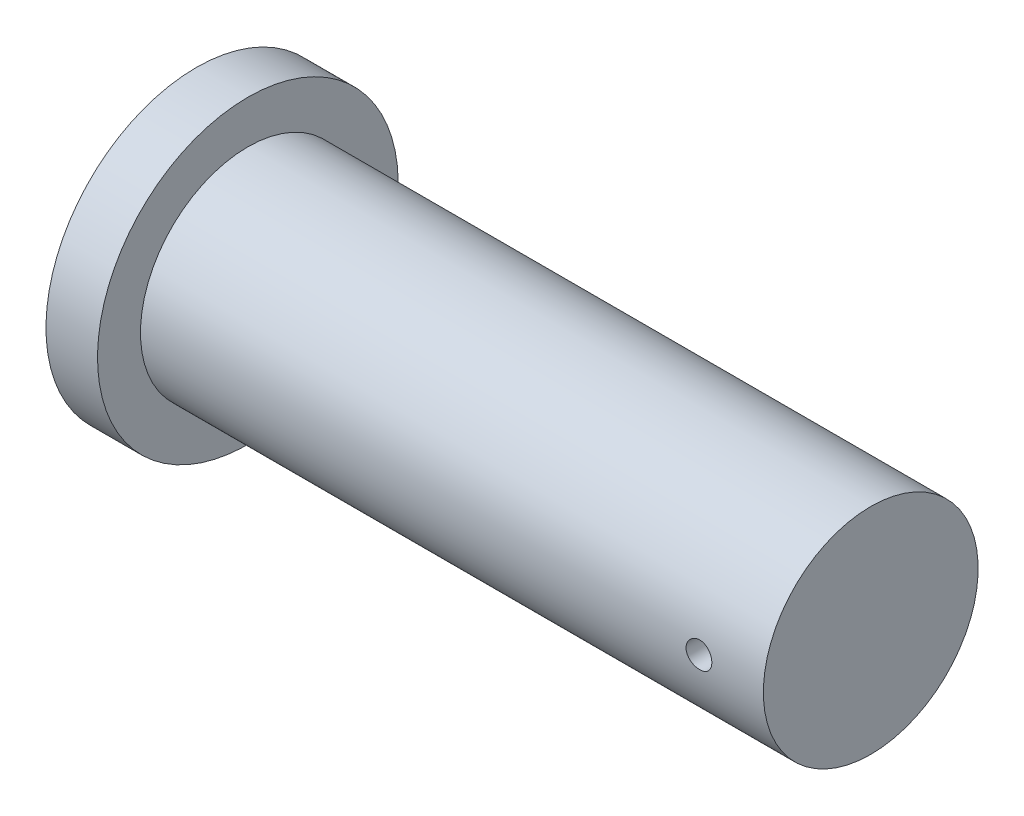
ISO-10303-21;
HEADER;
FILE_DESCRIPTION(('STEP AP214'),'2;1');
FILE_NAME('part.step','',(''),(''),'','','');
FILE_SCHEMA(('AUTOMOTIVE_DESIGN { 1 0 10303 214 1 1 1 1 }'));
ENDSEC;
DATA;
#1=APPLICATION_CONTEXT('core data for automotive mechanical design processes');
#2=APPLICATION_PROTOCOL_DEFINITION('international standard','automotive_design',2000,#1);
#3=PRODUCT_CONTEXT('',#1,'mechanical');
#4=PRODUCT('Part','Part','',(#3));
#5=PRODUCT_RELATED_PRODUCT_CATEGORY('part','',(#4));
#6=PRODUCT_DEFINITION_FORMATION('','',#4);
#7=PRODUCT_DEFINITION_CONTEXT('part definition',#1,'design');
#8=PRODUCT_DEFINITION('design','',#6,#7);
#9=PRODUCT_DEFINITION_SHAPE('','',#8);
#10=(LENGTH_UNIT() NAMED_UNIT(*) SI_UNIT(.MILLI.,.METRE.));
#11=(NAMED_UNIT(*) PLANE_ANGLE_UNIT() SI_UNIT($,.RADIAN.));
#12=(NAMED_UNIT(*) SI_UNIT($,.STERADIAN.) SOLID_ANGLE_UNIT());
#13=UNCERTAINTY_MEASURE_WITH_UNIT(LENGTH_MEASURE(1.E-05),#10,'distance_accuracy_value','');
#14=(GEOMETRIC_REPRESENTATION_CONTEXT(3) GLOBAL_UNCERTAINTY_ASSIGNED_CONTEXT((#13)) GLOBAL_UNIT_ASSIGNED_CONTEXT((#10,
#11,#12)) REPRESENTATION_CONTEXT('',''));
#15=CARTESIAN_POINT('',(0.,0.,0.));
#16=DIRECTION('',(0.,0.,1.));
#17=DIRECTION('',(1.,0.,0.));
#18=AXIS2_PLACEMENT_3D('',#15,#16,#17);
#19=CARTESIAN_POINT('',(0.,250.,0.));
#20=DIRECTION('',(1.,0.,0.));
#21=DIRECTION('',(0.,1.,0.));
#22=AXIS2_PLACEMENT_3D('',#19,#20,#21);
#23=PLANE('',#22);
#24=CARTESIAN_POINT('',(0.,0.,0.));
#25=DIRECTION('',(1.,0.,0.));
#26=DIRECTION('',(0.,1.,0.));
#27=AXIS2_PLACEMENT_3D('',#24,#25,#26);
#28=CIRCLE('',#27,250.);
#29=CARTESIAN_POINT('',(0.,250.,0.));
#30=VERTEX_POINT('',#29);
#31=EDGE_CURVE('E87',#30,#30,#28,.T.);
#32=ORIENTED_EDGE('',*,*,#31,.T.);
#33=EDGE_LOOP('',(#32));
#34=FACE_BOUND('',#33,.T.);
#35=ADVANCED_FACE('F37',(#34),#23,.T.);
#36=CARTESIAN_POINT('',(-1570.,-1.92269547466134E-13,0.));
#37=DIRECTION('',(-1.,0.,0.));
#38=DIRECTION('',(0.,-1.,0.));
#39=AXIS2_PLACEMENT_3D('',#36,#37,#38);
#40=PLANE('',#39);
#41=CARTESIAN_POINT('',(-1570.,-1.92269547466134E-13,0.));
#42=DIRECTION('',(1.,0.,0.));
#43=DIRECTION('',(0.,1.,0.));
#44=AXIS2_PLACEMENT_3D('',#41,#42,#43);
#45=CIRCLE('',#44,350.);
#46=CARTESIAN_POINT('',(-1570.,350.,0.));
#47=VERTEX_POINT('',#46);
#48=EDGE_CURVE('E10',#47,#47,#45,.T.);
#49=ORIENTED_EDGE('',*,*,#48,.F.);
#50=EDGE_LOOP('',(#49));
#51=FACE_BOUND('',#50,.T.);
#52=ADVANCED_FACE('F78',(#51),#40,.T.);
#53=CARTESIAN_POINT('',(0.,0.,0.));
#54=DIRECTION('',(1.,0.,0.));
#55=DIRECTION('',(0.,1.,0.));
#56=AXIS2_PLACEMENT_3D('',#53,#54,#55);
#57=CYLINDRICAL_SURFACE('',#56,350.);
#58=ORIENTED_EDGE('',*,*,#48,.T.);
#59=EDGE_LOOP('',(#58));
#60=FACE_BOUND('',#59,.T.);
#61=CARTESIAN_POINT('',(-1450.,-1.77573785876366E-13,0.));
#62=DIRECTION('',(1.,0.,0.));
#63=DIRECTION('',(0.,1.,0.));
#64=AXIS2_PLACEMENT_3D('',#61,#62,#63);
#65=CIRCLE('',#64,350.);
#66=CARTESIAN_POINT('',(-1450.,350.,0.));
#67=VERTEX_POINT('',#66);
#68=EDGE_CURVE('E49',#67,#67,#65,.T.);
#69=ORIENTED_EDGE('',*,*,#68,.F.);
#70=EDGE_LOOP('',(#69));
#71=FACE_BOUND('',#70,.T.);
#72=ADVANCED_FACE('F83',(#60,#71),#57,.T.);
#73=CARTESIAN_POINT('',(-1450.,350.,0.));
#74=DIRECTION('',(1.,0.,0.));
#75=DIRECTION('',(0.,1.,0.));
#76=AXIS2_PLACEMENT_3D('',#73,#74,#75);
#77=PLANE('',#76);
#78=ORIENTED_EDGE('',*,*,#68,.T.);
#79=EDGE_LOOP('',(#78));
#80=FACE_BOUND('',#79,.T.);
#81=CARTESIAN_POINT('',(-1450.,-1.77573785876366E-13,0.));
#82=DIRECTION('',(1.,0.,0.));
#83=DIRECTION('',(0.,1.,0.));
#84=AXIS2_PLACEMENT_3D('',#81,#82,#83);
#85=CIRCLE('',#84,250.);
#86=CARTESIAN_POINT('',(-1450.,250.,0.));
#87=VERTEX_POINT('',#86);
#88=EDGE_CURVE('E54',#87,#87,#85,.T.);
#89=ORIENTED_EDGE('',*,*,#88,.F.);
#90=EDGE_LOOP('',(#89));
#91=FACE_BOUND('',#90,.T.);
#92=ADVANCED_FACE('F73',(#80,#91),#77,.T.);
#93=CARTESIAN_POINT('',(0.,0.,0.));
#94=DIRECTION('',(1.,0.,0.));
#95=DIRECTION('',(0.,1.,0.));
#96=AXIS2_PLACEMENT_3D('',#93,#94,#95);
#97=CYLINDRICAL_SURFACE('',#96,250.);
#98=CARTESIAN_POINT('',(-120.,0.,-250.));
#99=CARTESIAN_POINT('',(-120.000005346627,-0.83945405127466,-249.999998427644));
#100=CARTESIAN_POINT('',(-120.03526435666,-1.67904898423964,-249.99576067469));
#101=CARTESIAN_POINT('',(-120.176066571599,-3.35235745506275,-249.978923633861));
#102=CARTESIAN_POINT('',(-120.281625909238,-4.18606959852959,-249.966322426718));
#103=CARTESIAN_POINT('',(-120.562390637872,-5.84237106939141,-249.933097836008));
#104=CARTESIAN_POINT('',(-120.737663413699,-6.6649488365192,-249.912466691139));
#105=CARTESIAN_POINT('',(-121.156547441611,-8.29223231071752,-249.86376596916));
#106=CARTESIAN_POINT('',(-121.400154792203,-9.09693903528748,-249.83569681672));
#107=CARTESIAN_POINT('',(-121.953748477802,-10.6823361170984,-249.772930285168));
#108=CARTESIAN_POINT('',(-122.263692038546,-11.4630415813524,-249.738237178796));
#109=CARTESIAN_POINT('',(-122.947811689272,-12.9955085848657,-249.66318384819));
#110=CARTESIAN_POINT('',(-123.321988638983,-13.747269736556,-249.622823548105));
#111=CARTESIAN_POINT('',(-124.131817378243,-15.2164575434318,-249.537574021802));
#112=CARTESIAN_POINT('',(-124.567457458546,-15.9338907036087,-249.492685658682));
#113=CARTESIAN_POINT('',(-125.497183637096,-17.3296017632529,-249.399627439957));
#114=CARTESIAN_POINT('',(-125.991269765624,-18.0078796424335,-249.351457582652));
#115=CARTESIAN_POINT('',(-127.036800933914,-19.3235799094482,-249.252956895924));
#116=CARTESIAN_POINT('',(-127.588496484192,-19.9608025795367,-249.202617239257));
#117=CARTESIAN_POINT('',(-128.743506096294,-21.1865667333287,-249.101400403225));
#118=CARTESIAN_POINT('',(-129.346820348556,-21.7751080374154,-249.050523221879));
#119=CARTESIAN_POINT('',(-130.60088592103,-22.89942348709,-248.949663759087));
#120=CARTESIAN_POINT('',(-131.251639568007,-23.4351950414417,-248.899681521686));
#121=CARTESIAN_POINT('',(-132.596022416188,-24.4501728279916,-248.802027882669));
#122=CARTESIAN_POINT('',(-133.289651649016,-24.9293790184681,-248.754356482758));
#123=CARTESIAN_POINT('',(-134.717159244087,-25.8292247600801,-248.662535213757));
#124=CARTESIAN_POINT('',(-135.451155773894,-26.2496780449677,-248.618396726018));
#125=CARTESIAN_POINT('',(-136.952250714039,-27.0272215131871,-248.535072510076));
#126=CARTESIAN_POINT('',(-137.719349214464,-27.3843115240604,-248.495886795354));
#127=CARTESIAN_POINT('',(-139.281188367429,-28.032515599827,-248.42359890783));
#128=CARTESIAN_POINT('',(-140.075928262581,-28.3236314708062,-248.390496568497));
#129=CARTESIAN_POINT('',(-141.687397118936,-28.8377514626015,-248.331333333469));
#130=CARTESIAN_POINT('',(-142.504125965885,-29.0607559372461,-248.305272401195));
#131=CARTESIAN_POINT('',(-144.149726388541,-29.4360846581789,-248.261057146818));
#132=CARTESIAN_POINT('',(-144.978520370394,-29.5887447148686,-248.242865285389));
#133=CARTESIAN_POINT('',(-146.646149449375,-29.8238284020412,-248.214732255072));
#134=CARTESIAN_POINT('',(-147.484984517532,-29.9062522351179,-248.204791062386));
#135=CARTESIAN_POINT('',(-149.166644933805,-30.0002450307839,-248.19344783994));
#136=CARTESIAN_POINT('',(-150.00947014953,-30.0118163279832,-248.192045528821));
#137=CARTESIAN_POINT('',(-151.693075974979,-29.9640232800952,-248.197820064069));
#138=CARTESIAN_POINT('',(-152.533856590468,-29.9046591352131,-248.204996886221));
#139=CARTESIAN_POINT('',(-154.202926136898,-29.715939469638,-248.227661409589));
#140=CARTESIAN_POINT('',(-155.031257513451,-29.5869537796197,-248.243105193029));
#141=CARTESIAN_POINT('',(-156.674046206638,-29.2601860389005,-248.28183288682));
#142=CARTESIAN_POINT('',(-157.488503579536,-29.0624042672649,-248.305116765368));
#143=CARTESIAN_POINT('',(-159.097813484399,-28.5994903101324,-248.358860098008));
#144=CARTESIAN_POINT('',(-159.89266575644,-28.3343572322224,-248.389319647177));
#145=CARTESIAN_POINT('',(-161.457187085205,-27.738664655671,-248.456548018414));
#146=CARTESIAN_POINT('',(-162.226856045004,-27.408104905256,-248.493316864761));
#147=CARTESIAN_POINT('',(-163.737575348741,-26.6830062587244,-248.57222377701));
#148=CARTESIAN_POINT('',(-164.47854773765,-26.2883064173459,-248.614375290999));
#149=CARTESIAN_POINT('',(-165.924640439941,-25.4383419240848,-248.702780909521));
#150=CARTESIAN_POINT('',(-166.629760714632,-24.9830772068439,-248.749035018482));
#151=CARTESIAN_POINT('',(-167.999292786588,-24.0151743294156,-248.844344505787));
#152=CARTESIAN_POINT('',(-168.663703134445,-23.5025341283083,-248.89339998375));
#153=CARTESIAN_POINT('',(-169.947200340764,-22.4234730226313,-248.992934300672));
#154=CARTESIAN_POINT('',(-170.566286997851,-21.8570518791371,-249.043413145953));
#155=CARTESIAN_POINT('',(-171.758646737848,-20.6705863424362,-249.144703934576));
#156=CARTESIAN_POINT('',(-172.331602684734,-20.0502231946621,-249.195515950421));
#157=CARTESIAN_POINT('',(-173.423250498429,-18.7633493050098,-249.295714253098));
#158=CARTESIAN_POINT('',(-173.941942120838,-18.0968383553096,-249.345100533509));
#159=CARTESIAN_POINT('',(-174.92139308389,-16.7223298235942,-249.441051568305));
#160=CARTESIAN_POINT('',(-175.382152156728,-16.0143320498192,-249.487616309647));
#161=CARTESIAN_POINT('',(-176.242444737583,-14.5618187134785,-249.576607016875));
#162=CARTESIAN_POINT('',(-176.641978358649,-13.8173032183439,-249.619032990403));
#163=CARTESIAN_POINT('',(-177.377049550801,-12.2967662420216,-249.69855670199));
#164=CARTESIAN_POINT('',(-177.712567646162,-11.5207352595533,-249.735652817678));
#165=CARTESIAN_POINT('',(-178.317006241948,-9.94288162849488,-249.803447904263));
#166=CARTESIAN_POINT('',(-178.585926680274,-9.14105895585625,-249.834146869194));
#167=CARTESIAN_POINT('',(-179.055174602152,-7.51737563299714,-249.888272637311));
#168=CARTESIAN_POINT('',(-179.25550450256,-6.69551568990363,-249.911699696726));
#169=CARTESIAN_POINT('',(-179.586089061088,-5.03763678036768,-249.950614478999));
#170=CARTESIAN_POINT('',(-179.716344097012,-4.20161789028748,-249.96610224466));
#171=CARTESIAN_POINT('',(-179.905217383584,-2.52663847297534,-249.988626299017));
#172=CARTESIAN_POINT('',(-179.964272334561,-1.68772785762065,-249.995714103622));
#173=CARTESIAN_POINT('',(-180.0117637464,-0.0078829513353258,-250.001410792097));
#174=CARTESIAN_POINT('',(-180.000200496197,0.833051331301368,-250.000019710659));
#175=CARTESIAN_POINT('',(-179.906543090912,2.51090931268568,-249.988798091526));
#176=CARTESIAN_POINT('',(-179.824450256217,3.34783308621919,-249.978967711823));
#177=CARTESIAN_POINT('',(-179.590346869864,5.01170532607637,-249.95114552155));
#178=CARTESIAN_POINT('',(-179.438336352258,5.83865379725791,-249.933153714955));
#179=CARTESIAN_POINT('',(-179.066088922277,7.47420576449588,-249.88958263873));
#180=CARTESIAN_POINT('',(-178.846059905325,8.28285721007878,-249.864026499123));
#181=CARTESIAN_POINT('',(-178.339234171467,9.87869947845688,-249.806022491859));
#182=CARTESIAN_POINT('',(-178.052437636466,10.6658903597139,-249.773574642977));
#183=CARTESIAN_POINT('',(-177.414141564622,12.2133271035439,-249.702692469727));
#184=CARTESIAN_POINT('',(-177.062640456793,12.973572311359,-249.664258000011));
#185=CARTESIAN_POINT('',(-176.297450820589,14.4618183158871,-249.582473928335));
#186=CARTESIAN_POINT('',(-175.883761985568,15.1898189535801,-249.53912430214));
#187=CARTESIAN_POINT('',(-174.995003842676,16.6119294838912,-249.448499601103));
#188=CARTESIAN_POINT('',(-174.519651211046,17.3058611879965,-249.401206791166));
#189=CARTESIAN_POINT('',(-173.512469865865,18.6512708563284,-249.304201897323));
#190=CARTESIAN_POINT('',(-172.98064099399,19.3027487015335,-249.254489806637));
#191=CARTESIAN_POINT('',(-171.864211900665,20.5587511304785,-249.154038242973));
#192=CARTESIAN_POINT('',(-171.279609978775,21.1632742000843,-249.103298736932));
#193=CARTESIAN_POINT('',(-170.06171730093,22.3211443743017,-249.00221753573));
#194=CARTESIAN_POINT('',(-169.428426407329,22.8744913342251,-248.951875841695));
#195=CARTESIAN_POINT('',(-168.11411100337,23.9289049535465,-248.852746580245));
#196=CARTESIAN_POINT('',(-167.432853677619,24.4296823576824,-248.803968542764));
#197=CARTESIAN_POINT('',(-166.030354585557,25.3720615147499,-248.709635600154));
#198=CARTESIAN_POINT('',(-165.309112658267,25.8136630294113,-248.664080708003));
#199=CARTESIAN_POINT('',(-163.831728956491,26.63451472715,-248.577499059833));
#200=CARTESIAN_POINT('',(-163.075587638486,27.013765725468,-248.536472244611));
#201=CARTESIAN_POINT('',(-161.53374503769,27.7071694386293,-248.460126591619));
#202=CARTESIAN_POINT('',(-160.748043869082,28.0213224049008,-248.424807731802));
#203=CARTESIAN_POINT('',(-159.154620880665,28.5815391846898,-248.360977149381));
#204=CARTESIAN_POINT('',(-158.346957539064,28.8277674457546,-248.332449009658));
#205=CARTESIAN_POINT('',(-156.713534810839,29.2513300866498,-248.282913650257));
#206=CARTESIAN_POINT('',(-155.887775443012,29.4286645380377,-248.261906422768));
#207=CARTESIAN_POINT('',(-154.224113630484,29.7131117234703,-248.228023284403));
#208=CARTESIAN_POINT('',(-153.386211621106,29.8202269685902,-248.215147082758));
#209=CARTESIAN_POINT('',(-151.704274566406,29.9634409548053,-248.197899733748));
#210=CARTESIAN_POINT('',(-150.860239549501,29.9995400247264,-248.193528547003));
#211=CARTESIAN_POINT('',(-149.177528892183,30.0004483294601,-248.193418700482));
#212=CARTESIAN_POINT('',(-148.33885346455,29.9657115732332,-248.197625064499));
#213=CARTESIAN_POINT('',(-146.66744692462,29.8261186730207,-248.214438684784));
#214=CARTESIAN_POINT('',(-145.834715785315,29.7212628478482,-248.227045902856));
#215=CARTESIAN_POINT('',(-144.181121542727,29.4422097998915,-248.260298854551));
#216=CARTESIAN_POINT('',(-143.360258412804,29.2680127327889,-248.280944570126));
#217=CARTESIAN_POINT('',(-141.736209269798,28.8515599124421,-248.329682859002));
#218=CARTESIAN_POINT('',(-140.933023289385,28.6093040334341,-248.357775446064));
#219=CARTESIAN_POINT('',(-139.350229254287,28.0585869614456,-248.420595792301));
#220=CARTESIAN_POINT('',(-138.570613978167,27.7501462851077,-248.455321494909));
#221=CARTESIAN_POINT('',(-137.040150160536,27.0692405602591,-248.53042762262));
#222=CARTESIAN_POINT('',(-136.289301596693,26.6967755614521,-248.570808043333));
#223=CARTESIAN_POINT('',(-134.821582782852,25.8904757326398,-248.656082823735));
#224=CARTESIAN_POINT('',(-134.104712573855,25.4566408285831,-248.700977188871));
#225=CARTESIAN_POINT('',(-132.709901315512,24.5306590453669,-248.794017611399));
#226=CARTESIAN_POINT('',(-132.031960436049,24.0385119117691,-248.84216368298));
#227=CARTESIAN_POINT('',(-130.715641390275,22.9961439995643,-248.940661605684));
#228=CARTESIAN_POINT('',(-130.077532033384,22.4455848372421,-248.991025196538));
#229=CARTESIAN_POINT('',(-128.849894389754,21.2927701818177,-249.092257297697));
#230=CARTESIAN_POINT('',(-128.260366467656,20.6905143007622,-249.143125811788));
#231=CARTESIAN_POINT('',(-127.133878261105,19.4383605491774,-249.243946054455));
#232=CARTESIAN_POINT('',(-126.596930691054,18.7884512217305,-249.29389755893));
#233=CARTESIAN_POINT('',(-125.579547002417,17.4456585948098,-249.391463451209));
#234=CARTESIAN_POINT('',(-125.099110130654,16.7527758682759,-249.439077870159));
#235=CARTESIAN_POINT('',(-124.196566278153,15.3263696607923,-249.5307893841));
#236=CARTESIAN_POINT('',(-123.774669453929,14.5927123574071,-249.574873577908));
#237=CARTESIAN_POINT('',(-122.994224006834,13.0921083320412,-249.658088778727));
#238=CARTESIAN_POINT('',(-122.635679277305,12.3251595677186,-249.697219481276));
#239=CARTESIAN_POINT('',(-121.984917833251,10.7642695324581,-249.769374260864));
#240=CARTESIAN_POINT('',(-121.692634729678,9.97035620343772,-249.802404443948));
#241=CARTESIAN_POINT('',(-121.176134680765,8.36056007104453,-249.861460077755));
#242=CARTESIAN_POINT('',(-120.951901535094,7.54468254701646,-249.887487195496));
#243=CARTESIAN_POINT('',(-120.63598410328,6.17039593972088,-249.924448384044));
#244=CARTESIAN_POINT('',(-120.52500720758,5.6163972029688,-249.937524836533));
#245=CARTESIAN_POINT('',(-120.334494079773,4.50296107882247,-249.960063263262));
#246=CARTESIAN_POINT('',(-120.254955250995,3.94352414451616,-249.969525536018));
#247=CARTESIAN_POINT('',(-120.127581934926,2.82095126859212,-249.984714242421));
#248=CARTESIAN_POINT('',(-120.079750285683,2.25781500040906,-249.99044034165));
#249=CARTESIAN_POINT('',(-120.015959238306,1.12980696078358,-249.998083544066));
#250=CARTESIAN_POINT('',(-119.99999640183,0.564935383151448,-250.000001058163));
#251=CARTESIAN_POINT('',(-120.,0.,-250.));
#252=B_SPLINE_CURVE_WITH_KNOTS('',3,(#98,#99,#100,#101,#102,#103,#104,#105,#106,#107,#108,#109,
#110,#111,#112,#113,#114,#115,#116,#117,#118,#119,#120,#121,#122,#123,#124,#125,#126,#127,#128,
#129,#130,#131,#132,#133,#134,#135,#136,#137,#138,#139,#140,#141,#142,#143,#144,#145,#146,#147,
#148,#149,#150,#151,#152,#153,#154,#155,#156,#157,#158,#159,#160,#161,#162,#163,#164,#165,#166,
#167,#168,#169,#170,#171,#172,#173,#174,#175,#176,#177,#178,#179,#180,#181,#182,#183,#184,#185,
#186,#187,#188,#189,#190,#191,#192,#193,#194,#195,#196,#197,#198,#199,#200,#201,#202,#203,#204,
#205,#206,#207,#208,#209,#210,#211,#212,#213,#214,#215,#216,#217,#218,#219,#220,#221,#222,#223,
#224,#225,#226,#227,#228,#229,#230,#231,#232,#233,#234,#235,#236,#237,#238,#239,#240,#241,#242,
#243,#244,#245,#246,#247,#248,#249,#250,#251),.UNSPECIFIED.,.T.,.F.,(4,2,2,2,2,2,2,2,2,2,2,2,2,
2,2,2,2,2,2,2,2,2,2,2,2,2,2,2,2,2,2,2,2,2,2,2,2,2,2,2,2,2,2,2,2,2,2,2,2,2,2,2,2,2,2,2,2,2,2,2,2,
2,2,2,2,2,2,2,2,2,2,2,2,2,2,2,4),(0.,2.5178568778085,5.03629176023941,7.55716689441418,
10.0778981310362,12.5970088452488,15.1161532790349,17.6348184409042,20.1534849077089,
22.6835996956624,25.2137238184145,27.7439721199683,30.2742222877829,32.8123205275703,
35.3504256752987,37.8884613323185,40.4264838044032,42.9522614297605,45.4780317695777,
48.0037188841395,50.5293988703263,53.0417925789435,55.554176096372,58.0665929049301,
60.5790193819087,63.0978504453098,65.616684226915,68.135607635171,70.6545422343887,
73.1895310278508,75.7245312381209,78.2595431665623,80.7945504142033,83.3303276726992,
85.8661072956545,88.4017975586305,90.9374741504342,93.4575179274344,95.9775513936526,
98.4975376832914,101.017522745675,103.529880494996,106.042231399598,108.554643310502,
111.067067610456,113.59147405372,116.115887573976,118.640382464334,121.164884491879,
123.702619817659,126.240365361265,128.778077720902,131.315780278947,133.847283965918,
136.378785023507,138.910195548371,141.441594352032,143.956819629024,146.472033470021,
148.987241664015,151.502454505813,154.016888779604,156.53132110138,159.045756457198,
161.560202784854,164.090105467188,166.620027136603,169.150559060915,171.681057254326,
174.220416971692,176.759932692741,179.29689265747,181.833248185529,183.527885490604,
185.222382795466,186.917031750959,188.611497860004),.UNSPECIFIED.);
#253=CARTESIAN_POINT('',(-120.,0.,-250.));
#254=VERTEX_POINT('',#253);
#255=EDGE_CURVE('E40',#254,#254,#252,.T.);
#256=ORIENTED_EDGE('',*,*,#255,.F.);
#257=EDGE_LOOP('',(#256));
#258=FACE_BOUND('',#257,.T.);
#259=CARTESIAN_POINT('',(-120.,0.,250.));
#260=CARTESIAN_POINT('',(-120.000005346627,0.83945405127466,249.999998427644));
#261=CARTESIAN_POINT('',(-120.03526435666,1.67904898423964,249.99576067469));
#262=CARTESIAN_POINT('',(-120.176066571599,3.35235745506275,249.978923633861));
#263=CARTESIAN_POINT('',(-120.281625909238,4.18606959852959,249.966322426718));
#264=CARTESIAN_POINT('',(-120.562390637872,5.84237106939141,249.933097836008));
#265=CARTESIAN_POINT('',(-120.737663413699,6.6649488365192,249.912466691139));
#266=CARTESIAN_POINT('',(-121.156547441611,8.29223231071752,249.86376596916));
#267=CARTESIAN_POINT('',(-121.400154792203,9.09693903528748,249.83569681672));
#268=CARTESIAN_POINT('',(-121.953748477802,10.6823361170984,249.772930285168));
#269=CARTESIAN_POINT('',(-122.263692038546,11.4630415813524,249.738237178796));
#270=CARTESIAN_POINT('',(-122.947811689272,12.9955085848657,249.66318384819));
#271=CARTESIAN_POINT('',(-123.321988638983,13.747269736556,249.622823548105));
#272=CARTESIAN_POINT('',(-124.131817378243,15.2164575434318,249.537574021802));
#273=CARTESIAN_POINT('',(-124.567457458546,15.9338907036087,249.492685658682));
#274=CARTESIAN_POINT('',(-125.497183637096,17.3296017632529,249.399627439957));
#275=CARTESIAN_POINT('',(-125.991269765624,18.0078796424335,249.351457582652));
#276=CARTESIAN_POINT('',(-127.036800933914,19.3235799094482,249.252956895924));
#277=CARTESIAN_POINT('',(-127.588496484192,19.9608025795367,249.202617239257));
#278=CARTESIAN_POINT('',(-128.743506096294,21.1865667333287,249.101400403225));
#279=CARTESIAN_POINT('',(-129.346820348556,21.7751080374154,249.050523221879));
#280=CARTESIAN_POINT('',(-130.60088592103,22.89942348709,248.949663759087));
#281=CARTESIAN_POINT('',(-131.251639568007,23.4351950414417,248.899681521686));
#282=CARTESIAN_POINT('',(-132.596022416188,24.4501728279916,248.802027882669));
#283=CARTESIAN_POINT('',(-133.289651649016,24.9293790184681,248.754356482758));
#284=CARTESIAN_POINT('',(-134.717159244087,25.8292247600801,248.662535213757));
#285=CARTESIAN_POINT('',(-135.451155773894,26.2496780449677,248.618396726018));
#286=CARTESIAN_POINT('',(-136.952250714039,27.0272215131871,248.535072510076));
#287=CARTESIAN_POINT('',(-137.719349214464,27.3843115240604,248.495886795354));
#288=CARTESIAN_POINT('',(-139.281188367429,28.032515599827,248.42359890783));
#289=CARTESIAN_POINT('',(-140.075928262581,28.3236314708062,248.390496568497));
#290=CARTESIAN_POINT('',(-141.687397118936,28.8377514626015,248.331333333469));
#291=CARTESIAN_POINT('',(-142.504125965885,29.0607559372461,248.305272401195));
#292=CARTESIAN_POINT('',(-144.149726388541,29.4360846581789,248.261057146818));
#293=CARTESIAN_POINT('',(-144.978520370394,29.5887447148686,248.242865285389));
#294=CARTESIAN_POINT('',(-146.646149449375,29.8238284020412,248.214732255072));
#295=CARTESIAN_POINT('',(-147.484984517532,29.9062522351179,248.204791062386));
#296=CARTESIAN_POINT('',(-149.166644933805,30.0002450307839,248.19344783994));
#297=CARTESIAN_POINT('',(-150.00947014953,30.0118163279832,248.192045528821));
#298=CARTESIAN_POINT('',(-151.693075974979,29.9640232800952,248.197820064069));
#299=CARTESIAN_POINT('',(-152.533856590468,29.9046591352131,248.204996886221));
#300=CARTESIAN_POINT('',(-154.202926136898,29.715939469638,248.227661409589));
#301=CARTESIAN_POINT('',(-155.031257513451,29.5869537796198,248.243105193029));
#302=CARTESIAN_POINT('',(-156.674046206638,29.2601860389005,248.28183288682));
#303=CARTESIAN_POINT('',(-157.488503579536,29.0624042672649,248.305116765368));
#304=CARTESIAN_POINT('',(-159.097813484399,28.5994903101324,248.358860098008));
#305=CARTESIAN_POINT('',(-159.89266575644,28.3343572322224,248.389319647177));
#306=CARTESIAN_POINT('',(-161.457187085205,27.738664655671,248.456548018414));
#307=CARTESIAN_POINT('',(-162.226856045004,27.408104905256,248.493316864761));
#308=CARTESIAN_POINT('',(-163.737575348741,26.6830062587244,248.57222377701));
#309=CARTESIAN_POINT('',(-164.47854773765,26.2883064173459,248.614375290999));
#310=CARTESIAN_POINT('',(-165.924640439941,25.4383419240848,248.702780909521));
#311=CARTESIAN_POINT('',(-166.629760714632,24.983077206844,248.749035018482));
#312=CARTESIAN_POINT('',(-167.999292786588,24.0151743294156,248.844344505787));
#313=CARTESIAN_POINT('',(-168.663703134445,23.5025341283083,248.89339998375));
#314=CARTESIAN_POINT('',(-169.947200340764,22.4234730226313,248.992934300671));
#315=CARTESIAN_POINT('',(-170.566286997851,21.8570518791371,249.043413145953));
#316=CARTESIAN_POINT('',(-171.758646737848,20.6705863424362,249.144703934576));
#317=CARTESIAN_POINT('',(-172.331602684734,20.0502231946621,249.195515950421));
#318=CARTESIAN_POINT('',(-173.423250498429,18.7633493050098,249.295714253098));
#319=CARTESIAN_POINT('',(-173.941942120838,18.0968383553095,249.345100533509));
#320=CARTESIAN_POINT('',(-174.92139308389,16.7223298235942,249.441051568305));
#321=CARTESIAN_POINT('',(-175.382152156728,16.0143320498192,249.487616309647));
#322=CARTESIAN_POINT('',(-176.242444737583,14.5618187134785,249.576607016875));
#323=CARTESIAN_POINT('',(-176.641978358649,13.8173032183439,249.619032990403));
#324=CARTESIAN_POINT('',(-177.377049550801,12.2967662420216,249.69855670199));
#325=CARTESIAN_POINT('',(-177.712567646162,11.5207352595533,249.735652817678));
#326=CARTESIAN_POINT('',(-178.317006241948,9.94288162849488,249.803447904263));
#327=CARTESIAN_POINT('',(-178.585926680274,9.14105895585625,249.834146869194));
#328=CARTESIAN_POINT('',(-179.055174602152,7.51737563299714,249.888272637311));
#329=CARTESIAN_POINT('',(-179.25550450256,6.69551568990363,249.911699696726));
#330=CARTESIAN_POINT('',(-179.586089061088,5.03763678036768,249.950614478999));
#331=CARTESIAN_POINT('',(-179.716344097012,4.20161789028749,249.96610224466));
#332=CARTESIAN_POINT('',(-179.905217383584,2.52663847297535,249.988626299017));
#333=CARTESIAN_POINT('',(-179.964272334561,1.68772785762065,249.995714103622));
#334=CARTESIAN_POINT('',(-180.0117637464,0.00788295133532407,250.001410792097));
#335=CARTESIAN_POINT('',(-180.000200496197,-0.833051331301376,250.000019710659));
#336=CARTESIAN_POINT('',(-179.906543090912,-2.51090931268569,249.988798091526));
#337=CARTESIAN_POINT('',(-179.824450256217,-3.34783308621919,249.978967711823));
#338=CARTESIAN_POINT('',(-179.590346869864,-5.01170532607637,249.95114552155));
#339=CARTESIAN_POINT('',(-179.438336352258,-5.83865379725791,249.933153714955));
#340=CARTESIAN_POINT('',(-179.066088922277,-7.47420576449588,249.88958263873));
#341=CARTESIAN_POINT('',(-178.846059905325,-8.28285721007878,249.864026499123));
#342=CARTESIAN_POINT('',(-178.339234171467,-9.87869947845688,249.806022491859));
#343=CARTESIAN_POINT('',(-178.052437636466,-10.6658903597139,249.773574642977));
#344=CARTESIAN_POINT('',(-177.414141564622,-12.2133271035439,249.702692469727));
#345=CARTESIAN_POINT('',(-177.062640456793,-12.973572311359,249.664258000011));
#346=CARTESIAN_POINT('',(-176.297450820589,-14.4618183158871,249.582473928335));
#347=CARTESIAN_POINT('',(-175.883761985568,-15.1898189535801,249.53912430214));
#348=CARTESIAN_POINT('',(-174.995003842676,-16.6119294838912,249.448499601103));
#349=CARTESIAN_POINT('',(-174.519651211046,-17.3058611879965,249.401206791166));
#350=CARTESIAN_POINT('',(-173.512469865865,-18.6512708563284,249.304201897323));
#351=CARTESIAN_POINT('',(-172.98064099399,-19.3027487015335,249.254489806637));
#352=CARTESIAN_POINT('',(-171.864211900665,-20.5587511304785,249.154038242973));
#353=CARTESIAN_POINT('',(-171.279609978775,-21.1632742000843,249.103298736932));
#354=CARTESIAN_POINT('',(-170.06171730093,-22.3211443743017,249.00221753573));
#355=CARTESIAN_POINT('',(-169.428426407329,-22.8744913342251,248.951875841695));
#356=CARTESIAN_POINT('',(-168.11411100337,-23.9289049535465,248.852746580245));
#357=CARTESIAN_POINT('',(-167.432853677619,-24.4296823576824,248.803968542764));
#358=CARTESIAN_POINT('',(-166.030354585557,-25.3720615147499,248.709635600154));
#359=CARTESIAN_POINT('',(-165.309112658267,-25.8136630294113,248.664080708003));
#360=CARTESIAN_POINT('',(-163.831728956491,-26.63451472715,248.577499059833));
#361=CARTESIAN_POINT('',(-163.075587638486,-27.013765725468,248.536472244611));
#362=CARTESIAN_POINT('',(-161.53374503769,-27.7071694386293,248.460126591619));
#363=CARTESIAN_POINT('',(-160.748043869082,-28.0213224049008,248.424807731802));
#364=CARTESIAN_POINT('',(-159.154620880665,-28.5815391846898,248.360977149381));
#365=CARTESIAN_POINT('',(-158.346957539064,-28.8277674457546,248.332449009658));
#366=CARTESIAN_POINT('',(-156.713534810839,-29.2513300866498,248.282913650257));
#367=CARTESIAN_POINT('',(-155.887775443012,-29.4286645380377,248.261906422768));
#368=CARTESIAN_POINT('',(-154.224113630484,-29.7131117234703,248.228023284403));
#369=CARTESIAN_POINT('',(-153.386211621106,-29.8202269685902,248.215147082758));
#370=CARTESIAN_POINT('',(-151.704274566406,-29.9634409548053,248.197899733748));
#371=CARTESIAN_POINT('',(-150.860239549501,-29.9995400247264,248.193528547003));
#372=CARTESIAN_POINT('',(-149.177528892183,-30.0004483294601,248.193418700482));
#373=CARTESIAN_POINT('',(-148.33885346455,-29.9657115732332,248.197625064499));
#374=CARTESIAN_POINT('',(-146.66744692462,-29.8261186730207,248.214438684784));
#375=CARTESIAN_POINT('',(-145.834715785315,-29.7212628478482,248.227045902856));
#376=CARTESIAN_POINT('',(-144.181121542727,-29.4422097998915,248.260298854551));
#377=CARTESIAN_POINT('',(-143.360258412804,-29.2680127327889,248.280944570126));
#378=CARTESIAN_POINT('',(-141.736209269798,-28.8515599124421,248.329682859002));
#379=CARTESIAN_POINT('',(-140.933023289385,-28.6093040334341,248.357775446064));
#380=CARTESIAN_POINT('',(-139.350229254287,-28.0585869614456,248.420595792301));
#381=CARTESIAN_POINT('',(-138.570613978167,-27.7501462851077,248.455321494909));
#382=CARTESIAN_POINT('',(-137.040150160536,-27.0692405602591,248.53042762262));
#383=CARTESIAN_POINT('',(-136.289301596693,-26.6967755614521,248.570808043333));
#384=CARTESIAN_POINT('',(-134.821582782852,-25.8904757326398,248.656082823735));
#385=CARTESIAN_POINT('',(-134.104712573855,-25.4566408285831,248.700977188871));
#386=CARTESIAN_POINT('',(-132.709901315512,-24.5306590453669,248.794017611399));
#387=CARTESIAN_POINT('',(-132.031960436049,-24.0385119117691,248.84216368298));
#388=CARTESIAN_POINT('',(-130.715641390275,-22.9961439995643,248.940661605684));
#389=CARTESIAN_POINT('',(-130.077532033384,-22.4455848372421,248.991025196538));
#390=CARTESIAN_POINT('',(-128.849894389754,-21.2927701818177,249.092257297697));
#391=CARTESIAN_POINT('',(-128.260366467656,-20.6905143007622,249.143125811788));
#392=CARTESIAN_POINT('',(-127.133878261105,-19.4383605491774,249.243946054455));
#393=CARTESIAN_POINT('',(-126.596930691054,-18.7884512217305,249.29389755893));
#394=CARTESIAN_POINT('',(-125.579547002417,-17.4456585948098,249.391463451209));
#395=CARTESIAN_POINT('',(-125.099110130654,-16.7527758682759,249.439077870159));
#396=CARTESIAN_POINT('',(-124.196566278153,-15.3263696607923,249.5307893841));
#397=CARTESIAN_POINT('',(-123.774669453929,-14.5927123574071,249.574873577908));
#398=CARTESIAN_POINT('',(-122.994224006834,-13.0921083320412,249.658088778727));
#399=CARTESIAN_POINT('',(-122.635679277305,-12.3251595677186,249.697219481276));
#400=CARTESIAN_POINT('',(-121.984917833251,-10.7642695324581,249.769374260864));
#401=CARTESIAN_POINT('',(-121.692634729678,-9.97035620343773,249.802404443948));
#402=CARTESIAN_POINT('',(-121.176134680765,-8.36056007104454,249.861460077755));
#403=CARTESIAN_POINT('',(-120.951901535094,-7.54468254701647,249.887487195496));
#404=CARTESIAN_POINT('',(-120.63598410328,-6.17039593972089,249.924448384044));
#405=CARTESIAN_POINT('',(-120.52500720758,-5.61639720296882,249.937524836533));
#406=CARTESIAN_POINT('',(-120.334494079773,-4.50296107882248,249.960063263262));
#407=CARTESIAN_POINT('',(-120.254955250995,-3.94352414451618,249.969525536018));
#408=CARTESIAN_POINT('',(-120.127581934926,-2.82095126859213,249.984714242421));
#409=CARTESIAN_POINT('',(-120.079750285683,-2.25781500040907,249.99044034165));
#410=CARTESIAN_POINT('',(-120.015959238306,-1.12980696078358,249.998083544066));
#411=CARTESIAN_POINT('',(-119.99999640183,-0.56493538315145,250.000001058163));
#412=CARTESIAN_POINT('',(-120.,0.,250.));
#413=B_SPLINE_CURVE_WITH_KNOTS('',3,(#259,#260,#261,#262,#263,#264,#265,#266,#267,#268,#269,
#270,#271,#272,#273,#274,#275,#276,#277,#278,#279,#280,#281,#282,#283,#284,#285,#286,#287,#288,
#289,#290,#291,#292,#293,#294,#295,#296,#297,#298,#299,#300,#301,#302,#303,#304,#305,#306,#307,
#308,#309,#310,#311,#312,#313,#314,#315,#316,#317,#318,#319,#320,#321,#322,#323,#324,#325,#326,
#327,#328,#329,#330,#331,#332,#333,#334,#335,#336,#337,#338,#339,#340,#341,#342,#343,#344,#345,
#346,#347,#348,#349,#350,#351,#352,#353,#354,#355,#356,#357,#358,#359,#360,#361,#362,#363,#364,
#365,#366,#367,#368,#369,#370,#371,#372,#373,#374,#375,#376,#377,#378,#379,#380,#381,#382,#383,
#384,#385,#386,#387,#388,#389,#390,#391,#392,#393,#394,#395,#396,#397,#398,#399,#400,#401,#402,
#403,#404,#405,#406,#407,#408,#409,#410,#411,#412),.UNSPECIFIED.,.T.,.F.,(4,2,2,2,2,2,2,2,2,2,2,
2,2,2,2,2,2,2,2,2,2,2,2,2,2,2,2,2,2,2,2,2,2,2,2,2,2,2,2,2,2,2,2,2,2,2,2,2,2,2,2,2,2,2,2,2,2,2,2,
2,2,2,2,2,2,2,2,2,2,2,2,2,2,2,2,2,4),(0.,2.5178568778085,5.03629176023941,7.55716689441418,
10.0778981310362,12.5970088452488,15.1161532790349,17.6348184409042,20.1534849077089,
22.6835996956624,25.2137238184145,27.7439721199683,30.2742222877829,32.8123205275703,
35.3504256752987,37.8884613323185,40.4264838044032,42.9522614297605,45.4780317695777,
48.0037188841396,50.5293988703263,53.0417925789435,55.554176096372,58.0665929049301,
60.5790193819087,63.0978504453098,65.616684226915,68.135607635171,70.6545422343887,
73.1895310278508,75.7245312381209,78.2595431665624,80.7945504142033,83.3303276726992,
85.8661072956545,88.4017975586306,90.9374741504343,93.4575179274344,95.9775513936527,
98.4975376832914,101.017522745675,103.529880494996,106.042231399598,108.554643310502,
111.067067610456,113.59147405372,116.115887573976,118.640382464334,121.164884491879,
123.702619817659,126.240365361265,128.778077720902,131.315780278947,133.847283965918,
136.378785023507,138.910195548371,141.441594352032,143.956819629024,146.472033470021,
148.987241664015,151.502454505813,154.016888779604,156.53132110138,159.045756457198,
161.560202784854,164.090105467188,166.620027136603,169.150559060915,171.681057254326,
174.220416971692,176.759932692741,179.29689265747,181.833248185529,183.527885490604,
185.222382795466,186.917031750959,188.611497860004),.UNSPECIFIED.);
#414=CARTESIAN_POINT('',(-120.,0.,250.));
#415=VERTEX_POINT('',#414);
#416=EDGE_CURVE('E57',#415,#415,#413,.T.);
#417=ORIENTED_EDGE('',*,*,#416,.F.);
#418=EDGE_LOOP('',(#417));
#419=FACE_BOUND('',#418,.T.);
#420=ORIENTED_EDGE('',*,*,#88,.T.);
#421=EDGE_LOOP('',(#420));
#422=FACE_BOUND('',#421,.T.);
#423=ORIENTED_EDGE('',*,*,#31,.F.);
#424=EDGE_LOOP('',(#423));
#425=FACE_BOUND('',#424,.T.);
#426=ADVANCED_FACE('F62',(#258,#419,#422,#425),#97,.T.);
#427=CARTESIAN_POINT('',(-150.,0.,-428.5));
#428=DIRECTION('',(0.,0.,1.));
#429=DIRECTION('',(1.,0.,0.));
#430=AXIS2_PLACEMENT_3D('',#427,#428,#429);
#431=CYLINDRICAL_SURFACE('',#430,30.);
#432=ORIENTED_EDGE('',*,*,#255,.T.);
#433=EDGE_LOOP('',(#432));
#434=FACE_BOUND('',#433,.T.);
#435=ORIENTED_EDGE('',*,*,#416,.T.);
#436=EDGE_LOOP('',(#435));
#437=FACE_BOUND('',#436,.T.);
#438=ADVANCED_FACE('F65',(#434,#437),#431,.F.);
#439=CLOSED_SHELL('',(#35,#52,#72,#92,#426,#438));
#440=MANIFOLD_SOLID_BREP('B2',#439);
#441=ADVANCED_BREP_SHAPE_REPRESENTATION('',(#18,#440),#14);
#442=SHAPE_DEFINITION_REPRESENTATION(#9,#441);
ENDSEC;
END-ISO-10303-21;
